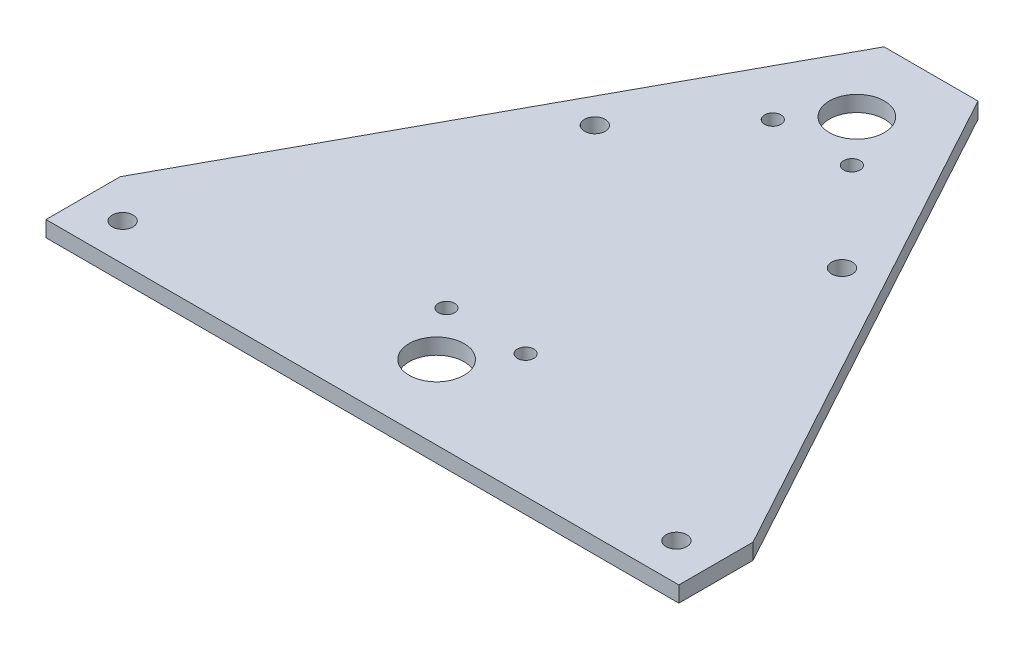
ISO-10303-21;
HEADER;
FILE_DESCRIPTION(('STEP AP214'),'2;1');
FILE_NAME('part.step','',(''),(''),'','','');
FILE_SCHEMA(('AUTOMOTIVE_DESIGN { 1 0 10303 214 1 1 1 1 }'));
ENDSEC;
DATA;
#1=APPLICATION_CONTEXT('core data for automotive mechanical design processes');
#2=APPLICATION_PROTOCOL_DEFINITION('international standard','automotive_design',2000,#1);
#3=PRODUCT_CONTEXT('',#1,'mechanical');
#4=PRODUCT('Part','Part','',(#3));
#5=PRODUCT_RELATED_PRODUCT_CATEGORY('part','',(#4));
#6=PRODUCT_DEFINITION_FORMATION('','',#4);
#7=PRODUCT_DEFINITION_CONTEXT('part definition',#1,'design');
#8=PRODUCT_DEFINITION('design','',#6,#7);
#9=PRODUCT_DEFINITION_SHAPE('','',#8);
#10=(LENGTH_UNIT() NAMED_UNIT(*) SI_UNIT(.MILLI.,.METRE.));
#11=(NAMED_UNIT(*) PLANE_ANGLE_UNIT() SI_UNIT($,.RADIAN.));
#12=(NAMED_UNIT(*) SI_UNIT($,.STERADIAN.) SOLID_ANGLE_UNIT());
#13=UNCERTAINTY_MEASURE_WITH_UNIT(LENGTH_MEASURE(1.E-05),#10,'distance_accuracy_value','');
#14=(GEOMETRIC_REPRESENTATION_CONTEXT(3) GLOBAL_UNCERTAINTY_ASSIGNED_CONTEXT((#13)) GLOBAL_UNIT_ASSIGNED_CONTEXT((#10,
#11,#12)) REPRESENTATION_CONTEXT('',''));
#15=CARTESIAN_POINT('',(0.,0.,0.));
#16=DIRECTION('',(0.,0.,1.));
#17=DIRECTION('',(1.,0.,0.));
#18=AXIS2_PLACEMENT_3D('',#15,#16,#17);
#19=CARTESIAN_POINT('',(0.,16.,0.));
#20=DIRECTION('',(0.,1.,0.));
#21=DIRECTION('',(0.,0.,1.));
#22=AXIS2_PLACEMENT_3D('',#19,#20,#21);
#23=PLANE('',#22);
#24=CARTESIAN_POINT('',(125.,16.,-285.));
#25=DIRECTION('',(0.,1.,0.));
#26=DIRECTION('',(0.,0.,1.));
#27=AXIS2_PLACEMENT_3D('',#24,#25,#26);
#28=CIRCLE('',#27,10.5);
#29=CARTESIAN_POINT('',(125.,16.,-274.5));
#30=VERTEX_POINT('',#29);
#31=EDGE_CURVE('E219',#30,#30,#28,.T.);
#32=ORIENTED_EDGE('',*,*,#31,.F.);
#33=EDGE_LOOP('',(#32));
#34=FACE_BOUND('',#33,.T.);
#35=CARTESIAN_POINT('',(-280.,16.,37.5));
#36=DIRECTION('',(0.,1.,0.));
#37=DIRECTION('',(0.,0.,-1.));
#38=AXIS2_PLACEMENT_3D('',#35,#36,#37);
#39=CIRCLE('',#38,10.5);
#40=CARTESIAN_POINT('',(-280.,16.,27.));
#41=VERTEX_POINT('',#40);
#42=EDGE_CURVE('E231',#41,#41,#39,.T.);
#43=ORIENTED_EDGE('',*,*,#42,.F.);
#44=EDGE_LOOP('',(#43));
#45=FACE_BOUND('',#44,.T.);
#46=CARTESIAN_POINT('',(40.,16.,-380.));
#47=DIRECTION('',(0.,1.,0.));
#48=DIRECTION('',(0.,0.,1.));
#49=AXIS2_PLACEMENT_3D('',#46,#47,#48);
#50=CIRCLE('',#49,8.29999999999999);
#51=CARTESIAN_POINT('',(40.,16.,-371.7));
#52=VERTEX_POINT('',#51);
#53=EDGE_CURVE('E243',#52,#52,#50,.T.);
#54=ORIENTED_EDGE('',*,*,#53,.F.);
#55=EDGE_LOOP('',(#54));
#56=FACE_BOUND('',#55,.T.);
#57=CARTESIAN_POINT('',(40.,16.,-49.9999999999999));
#58=DIRECTION('',(0.,1.,0.));
#59=DIRECTION('',(0.,0.,1.));
#60=AXIS2_PLACEMENT_3D('',#57,#58,#59);
#61=CIRCLE('',#60,8.3);
#62=CARTESIAN_POINT('',(40.,16.,-41.6999999999999));
#63=VERTEX_POINT('',#62);
#64=EDGE_CURVE('E255',#63,#63,#61,.T.);
#65=ORIENTED_EDGE('',*,*,#64,.F.);
#66=EDGE_LOOP('',(#65));
#67=FACE_BOUND('',#66,.T.);
#68=CARTESIAN_POINT('',(0.,16.,0.));
#69=DIRECTION('',(0.,1.,0.));
#70=DIRECTION('',(0.,0.,1.));
#71=AXIS2_PLACEMENT_3D('',#68,#69,#70);
#72=CIRCLE('',#71,27.8);
#73=CARTESIAN_POINT('',(0.,16.,27.8));
#74=VERTEX_POINT('',#73);
#75=EDGE_CURVE('E128',#74,#74,#72,.T.);
#76=ORIENTED_EDGE('',*,*,#75,.F.);
#77=EDGE_LOOP('',(#76));
#78=FACE_BOUND('',#77,.T.);
#79=DIRECTION('',(0.,0.,-1.));
#80=VECTOR('',#79,1.);
#81=CARTESIAN_POINT('',(320.,16.,75.));
#82=LINE('',#81,#80);
#83=CARTESIAN_POINT('',(320.,16.,75.));
#84=VERTEX_POINT('',#83);
#85=CARTESIAN_POINT('',(320.,16.,0.));
#86=VERTEX_POINT('',#85);
#87=EDGE_CURVE('E135',#84,#86,#82,.T.);
#88=ORIENTED_EDGE('',*,*,#87,.T.);
#89=DIRECTION('',(-0.478544499492619,0.,-0.87806330182132));
#90=VECTOR('',#89,1.);
#91=CARTESIAN_POINT('',(320.,16.,0.));
#92=LINE('',#91,#90);
#93=CARTESIAN_POINT('',(47.5,16.,-500.));
#94=VERTEX_POINT('',#93);
#95=EDGE_CURVE('E93',#86,#94,#92,.T.);
#96=ORIENTED_EDGE('',*,*,#95,.T.);
#97=DIRECTION('',(-1.,0.,0.));
#98=VECTOR('',#97,1.);
#99=CARTESIAN_POINT('',(47.5,16.,-500.));
#100=LINE('',#99,#98);
#101=CARTESIAN_POINT('',(-47.5,16.,-500.));
#102=VERTEX_POINT('',#101);
#103=EDGE_CURVE('E106',#94,#102,#100,.T.);
#104=ORIENTED_EDGE('',*,*,#103,.T.);
#105=DIRECTION('',(-0.478544499492619,0.,0.87806330182132));
#106=VECTOR('',#105,1.);
#107=CARTESIAN_POINT('',(-320.,16.,0.));
#108=LINE('',#107,#106);
#109=CARTESIAN_POINT('',(-320.,16.,0.));
#110=VERTEX_POINT('',#109);
#111=EDGE_CURVE('E100',#102,#110,#108,.T.);
#112=ORIENTED_EDGE('',*,*,#111,.T.);
#113=DIRECTION('',(0.,0.,1.));
#114=VECTOR('',#113,1.);
#115=CARTESIAN_POINT('',(-320.,16.,75.));
#116=LINE('',#115,#114);
#117=CARTESIAN_POINT('',(-320.,16.,75.));
#118=VERTEX_POINT('',#117);
#119=EDGE_CURVE('E104',#110,#118,#116,.T.);
#120=ORIENTED_EDGE('',*,*,#119,.T.);
#121=DIRECTION('',(1.,0.,0.));
#122=VECTOR('',#121,1.);
#123=CARTESIAN_POINT('',(320.,16.,75.));
#124=LINE('',#123,#122);
#125=EDGE_CURVE('E56',#118,#84,#124,.T.);
#126=ORIENTED_EDGE('',*,*,#125,.T.);
#127=EDGE_LOOP('',(#88,#96,#104,#112,#120,#126));
#128=FACE_BOUND('',#127,.T.);
#129=CARTESIAN_POINT('',(0.,16.,-425.));
#130=DIRECTION('',(0.,1.,0.));
#131=DIRECTION('',(0.,0.,1.));
#132=AXIS2_PLACEMENT_3D('',#129,#130,#131);
#133=CIRCLE('',#132,27.8);
#134=CARTESIAN_POINT('',(0.,16.,-397.2));
#135=VERTEX_POINT('',#134);
#136=EDGE_CURVE('E261',#135,#135,#133,.T.);
#137=ORIENTED_EDGE('',*,*,#136,.F.);
#138=EDGE_LOOP('',(#137));
#139=FACE_BOUND('',#138,.T.);
#140=CARTESIAN_POINT('',(-40.,16.,-49.9999999999999));
#141=DIRECTION('',(0.,1.,0.));
#142=DIRECTION('',(0.,0.,-1.));
#143=AXIS2_PLACEMENT_3D('',#140,#141,#142);
#144=CIRCLE('',#143,8.3);
#145=CARTESIAN_POINT('',(-40.,16.,-58.2999999999999));
#146=VERTEX_POINT('',#145);
#147=EDGE_CURVE('E249',#146,#146,#144,.T.);
#148=ORIENTED_EDGE('',*,*,#147,.F.);
#149=EDGE_LOOP('',(#148));
#150=FACE_BOUND('',#149,.T.);
#151=CARTESIAN_POINT('',(-40.,16.,-380.));
#152=DIRECTION('',(0.,1.,0.));
#153=DIRECTION('',(0.,0.,-1.));
#154=AXIS2_PLACEMENT_3D('',#151,#152,#153);
#155=CIRCLE('',#154,8.29999999999999);
#156=CARTESIAN_POINT('',(-40.,16.,-388.3));
#157=VERTEX_POINT('',#156);
#158=EDGE_CURVE('E237',#157,#157,#155,.T.);
#159=ORIENTED_EDGE('',*,*,#158,.F.);
#160=EDGE_LOOP('',(#159));
#161=FACE_BOUND('',#160,.T.);
#162=CARTESIAN_POINT('',(280.,16.,37.5));
#163=DIRECTION('',(0.,1.,0.));
#164=DIRECTION('',(0.,0.,1.));
#165=AXIS2_PLACEMENT_3D('',#162,#163,#164);
#166=CIRCLE('',#165,10.5);
#167=CARTESIAN_POINT('',(280.,16.,48.));
#168=VERTEX_POINT('',#167);
#169=EDGE_CURVE('E225',#168,#168,#166,.T.);
#170=ORIENTED_EDGE('',*,*,#169,.F.);
#171=EDGE_LOOP('',(#170));
#172=FACE_BOUND('',#171,.T.);
#173=CARTESIAN_POINT('',(-125.,16.,-285.));
#174=DIRECTION('',(0.,1.,0.));
#175=DIRECTION('',(0.,0.,-1.));
#176=AXIS2_PLACEMENT_3D('',#173,#174,#175);
#177=CIRCLE('',#176,10.5);
#178=CARTESIAN_POINT('',(-125.,16.,-295.5));
#179=VERTEX_POINT('',#178);
#180=EDGE_CURVE('E210',#179,#179,#177,.T.);
#181=ORIENTED_EDGE('',*,*,#180,.F.);
#182=EDGE_LOOP('',(#181));
#183=FACE_BOUND('',#182,.T.);
#184=ADVANCED_FACE('F39',(#34,#45,#56,#67,#78,#128,#139,#150,#161,#172,#183),#23,.T.);
#185=CARTESIAN_POINT('',(0.,0.,0.));
#186=DIRECTION('',(0.,1.,0.));
#187=DIRECTION('',(0.,0.,1.));
#188=AXIS2_PLACEMENT_3D('',#185,#186,#187);
#189=PLANE('',#188);
#190=DIRECTION('',(0.,0.,-1.));
#191=VECTOR('',#190,1.);
#192=CARTESIAN_POINT('',(320.,0.,75.));
#193=LINE('',#192,#191);
#194=CARTESIAN_POINT('',(320.,0.,75.));
#195=VERTEX_POINT('',#194);
#196=CARTESIAN_POINT('',(320.,0.,0.));
#197=VERTEX_POINT('',#196);
#198=EDGE_CURVE('E124',#195,#197,#193,.T.);
#199=ORIENTED_EDGE('',*,*,#198,.F.);
#200=DIRECTION('',(1.,0.,0.));
#201=VECTOR('',#200,1.);
#202=CARTESIAN_POINT('',(320.,0.,75.));
#203=LINE('',#202,#201);
#204=CARTESIAN_POINT('',(-320.,0.,75.));
#205=VERTEX_POINT('',#204);
#206=EDGE_CURVE('E85',#205,#195,#203,.T.);
#207=ORIENTED_EDGE('',*,*,#206,.F.);
#208=DIRECTION('',(0.,0.,1.));
#209=VECTOR('',#208,1.);
#210=CARTESIAN_POINT('',(-320.,0.,75.));
#211=LINE('',#210,#209);
#212=CARTESIAN_POINT('',(-320.,0.,0.));
#213=VERTEX_POINT('',#212);
#214=EDGE_CURVE('E79',#213,#205,#211,.T.);
#215=ORIENTED_EDGE('',*,*,#214,.F.);
#216=DIRECTION('',(-0.478544499492619,0.,0.87806330182132));
#217=VECTOR('',#216,1.);
#218=CARTESIAN_POINT('',(-320.,0.,0.));
#219=LINE('',#218,#217);
#220=CARTESIAN_POINT('',(-47.5,0.,-500.));
#221=VERTEX_POINT('',#220);
#222=EDGE_CURVE('E114',#221,#213,#219,.T.);
#223=ORIENTED_EDGE('',*,*,#222,.F.);
#224=DIRECTION('',(-1.,0.,0.));
#225=VECTOR('',#224,1.);
#226=CARTESIAN_POINT('',(47.5,0.,-500.));
#227=LINE('',#226,#225);
#228=CARTESIAN_POINT('',(47.5,0.,-500.));
#229=VERTEX_POINT('',#228);
#230=EDGE_CURVE('E130',#229,#221,#227,.T.);
#231=ORIENTED_EDGE('',*,*,#230,.F.);
#232=DIRECTION('',(-0.478544499492619,0.,-0.87806330182132));
#233=VECTOR('',#232,1.);
#234=CARTESIAN_POINT('',(320.,0.,0.));
#235=LINE('',#234,#233);
#236=EDGE_CURVE('E127',#197,#229,#235,.T.);
#237=ORIENTED_EDGE('',*,*,#236,.F.);
#238=EDGE_LOOP('',(#199,#207,#215,#223,#231,#237));
#239=FACE_BOUND('',#238,.T.);
#240=CARTESIAN_POINT('',(0.,0.,0.));
#241=DIRECTION('',(0.,1.,0.));
#242=DIRECTION('',(0.,0.,1.));
#243=AXIS2_PLACEMENT_3D('',#240,#241,#242);
#244=CIRCLE('',#243,27.8);
#245=CARTESIAN_POINT('',(0.,0.,27.8));
#246=VERTEX_POINT('',#245);
#247=EDGE_CURVE('E264',#246,#246,#244,.T.);
#248=ORIENTED_EDGE('',*,*,#247,.T.);
#249=EDGE_LOOP('',(#248));
#250=FACE_BOUND('',#249,.T.);
#251=CARTESIAN_POINT('',(0.,0.,-425.));
#252=DIRECTION('',(0.,1.,0.));
#253=DIRECTION('',(0.,0.,1.));
#254=AXIS2_PLACEMENT_3D('',#251,#252,#253);
#255=CIRCLE('',#254,27.8);
#256=CARTESIAN_POINT('',(0.,0.,-397.2));
#257=VERTEX_POINT('',#256);
#258=EDGE_CURVE('E258',#257,#257,#255,.T.);
#259=ORIENTED_EDGE('',*,*,#258,.T.);
#260=EDGE_LOOP('',(#259));
#261=FACE_BOUND('',#260,.T.);
#262=CARTESIAN_POINT('',(40.,0.,-49.9999999999999));
#263=DIRECTION('',(0.,1.,0.));
#264=DIRECTION('',(0.,0.,1.));
#265=AXIS2_PLACEMENT_3D('',#262,#263,#264);
#266=CIRCLE('',#265,8.3);
#267=CARTESIAN_POINT('',(40.,0.,-41.6999999999999));
#268=VERTEX_POINT('',#267);
#269=EDGE_CURVE('E252',#268,#268,#266,.T.);
#270=ORIENTED_EDGE('',*,*,#269,.T.);
#271=EDGE_LOOP('',(#270));
#272=FACE_BOUND('',#271,.T.);
#273=CARTESIAN_POINT('',(-40.,0.,-49.9999999999999));
#274=DIRECTION('',(0.,1.,0.));
#275=DIRECTION('',(0.,0.,-1.));
#276=AXIS2_PLACEMENT_3D('',#273,#274,#275);
#277=CIRCLE('',#276,8.3);
#278=CARTESIAN_POINT('',(-40.,0.,-58.2999999999999));
#279=VERTEX_POINT('',#278);
#280=EDGE_CURVE('E246',#279,#279,#277,.T.);
#281=ORIENTED_EDGE('',*,*,#280,.T.);
#282=EDGE_LOOP('',(#281));
#283=FACE_BOUND('',#282,.T.);
#284=CARTESIAN_POINT('',(40.,0.,-380.));
#285=DIRECTION('',(0.,1.,0.));
#286=DIRECTION('',(0.,0.,1.));
#287=AXIS2_PLACEMENT_3D('',#284,#285,#286);
#288=CIRCLE('',#287,8.29999999999999);
#289=CARTESIAN_POINT('',(40.,0.,-371.7));
#290=VERTEX_POINT('',#289);
#291=EDGE_CURVE('E240',#290,#290,#288,.T.);
#292=ORIENTED_EDGE('',*,*,#291,.T.);
#293=EDGE_LOOP('',(#292));
#294=FACE_BOUND('',#293,.T.);
#295=CARTESIAN_POINT('',(-40.,0.,-380.));
#296=DIRECTION('',(0.,1.,0.));
#297=DIRECTION('',(0.,0.,-1.));
#298=AXIS2_PLACEMENT_3D('',#295,#296,#297);
#299=CIRCLE('',#298,8.29999999999999);
#300=CARTESIAN_POINT('',(-40.,0.,-388.3));
#301=VERTEX_POINT('',#300);
#302=EDGE_CURVE('E234',#301,#301,#299,.T.);
#303=ORIENTED_EDGE('',*,*,#302,.T.);
#304=EDGE_LOOP('',(#303));
#305=FACE_BOUND('',#304,.T.);
#306=CARTESIAN_POINT('',(-280.,0.,37.5));
#307=DIRECTION('',(0.,1.,0.));
#308=DIRECTION('',(0.,0.,-1.));
#309=AXIS2_PLACEMENT_3D('',#306,#307,#308);
#310=CIRCLE('',#309,10.5);
#311=CARTESIAN_POINT('',(-280.,0.,27.));
#312=VERTEX_POINT('',#311);
#313=EDGE_CURVE('E228',#312,#312,#310,.T.);
#314=ORIENTED_EDGE('',*,*,#313,.T.);
#315=EDGE_LOOP('',(#314));
#316=FACE_BOUND('',#315,.T.);
#317=CARTESIAN_POINT('',(280.,0.,37.5));
#318=DIRECTION('',(0.,1.,0.));
#319=DIRECTION('',(0.,0.,1.));
#320=AXIS2_PLACEMENT_3D('',#317,#318,#319);
#321=CIRCLE('',#320,10.5);
#322=CARTESIAN_POINT('',(280.,0.,48.));
#323=VERTEX_POINT('',#322);
#324=EDGE_CURVE('E222',#323,#323,#321,.T.);
#325=ORIENTED_EDGE('',*,*,#324,.T.);
#326=EDGE_LOOP('',(#325));
#327=FACE_BOUND('',#326,.T.);
#328=CARTESIAN_POINT('',(125.,0.,-285.));
#329=DIRECTION('',(0.,1.,0.));
#330=DIRECTION('',(0.,0.,1.));
#331=AXIS2_PLACEMENT_3D('',#328,#329,#330);
#332=CIRCLE('',#331,10.5);
#333=CARTESIAN_POINT('',(125.,0.,-274.5));
#334=VERTEX_POINT('',#333);
#335=EDGE_CURVE('E216',#334,#334,#332,.T.);
#336=ORIENTED_EDGE('',*,*,#335,.T.);
#337=EDGE_LOOP('',(#336));
#338=FACE_BOUND('',#337,.T.);
#339=CARTESIAN_POINT('',(-125.,0.,-285.));
#340=DIRECTION('',(0.,1.,0.));
#341=DIRECTION('',(0.,0.,-1.));
#342=AXIS2_PLACEMENT_3D('',#339,#340,#341);
#343=CIRCLE('',#342,10.5);
#344=CARTESIAN_POINT('',(-125.,0.,-295.5));
#345=VERTEX_POINT('',#344);
#346=EDGE_CURVE('E213',#345,#345,#343,.T.);
#347=ORIENTED_EDGE('',*,*,#346,.T.);
#348=EDGE_LOOP('',(#347));
#349=FACE_BOUND('',#348,.T.);
#350=ADVANCED_FACE('F144',(#239,#250,#261,#272,#283,#294,#305,#316,#327,#338,#349),#189,.F.);
#351=CARTESIAN_POINT('',(320.,16.,75.));
#352=DIRECTION('',(-1.,0.,0.));
#353=DIRECTION('',(0.,0.,1.));
#354=AXIS2_PLACEMENT_3D('',#351,#352,#353);
#355=PLANE('',#354);
#356=ORIENTED_EDGE('',*,*,#198,.T.);
#357=DIRECTION('',(0.,-1.,0.));
#358=VECTOR('',#357,1.);
#359=CARTESIAN_POINT('',(320.,16.,0.));
#360=LINE('',#359,#358);
#361=EDGE_CURVE('E11',#86,#197,#360,.T.);
#362=ORIENTED_EDGE('',*,*,#361,.F.);
#363=ORIENTED_EDGE('',*,*,#87,.F.);
#364=DIRECTION('',(0.,-1.,0.));
#365=VECTOR('',#364,1.);
#366=CARTESIAN_POINT('',(320.,16.,75.));
#367=LINE('',#366,#365);
#368=EDGE_CURVE('E120',#84,#195,#367,.T.);
#369=ORIENTED_EDGE('',*,*,#368,.T.);
#370=EDGE_LOOP('',(#356,#362,#363,#369));
#371=FACE_BOUND('',#370,.T.);
#372=ADVANCED_FACE('F41',(#371),#355,.F.);
#373=CARTESIAN_POINT('',(320.,16.,0.));
#374=DIRECTION('',(-0.87806330182132,0.,0.478544499492619));
#375=DIRECTION('',(0.478544499492619,0.,0.87806330182132));
#376=AXIS2_PLACEMENT_3D('',#373,#374,#375);
#377=PLANE('',#376);
#378=ORIENTED_EDGE('',*,*,#236,.T.);
#379=DIRECTION('',(0.,-1.,0.));
#380=VECTOR('',#379,1.);
#381=CARTESIAN_POINT('',(47.5,16.,-500.));
#382=LINE('',#381,#380);
#383=EDGE_CURVE('E48',#94,#229,#382,.T.);
#384=ORIENTED_EDGE('',*,*,#383,.F.);
#385=ORIENTED_EDGE('',*,*,#95,.F.);
#386=ORIENTED_EDGE('',*,*,#361,.T.);
#387=EDGE_LOOP('',(#378,#384,#385,#386));
#388=FACE_BOUND('',#387,.T.);
#389=ADVANCED_FACE('F386',(#388),#377,.F.);
#390=CARTESIAN_POINT('',(47.5,16.,-500.));
#391=DIRECTION('',(0.,0.,1.));
#392=DIRECTION('',(1.,0.,0.));
#393=AXIS2_PLACEMENT_3D('',#390,#391,#392);
#394=PLANE('',#393);
#395=ORIENTED_EDGE('',*,*,#230,.T.);
#396=DIRECTION('',(0.,-1.,0.));
#397=VECTOR('',#396,1.);
#398=CARTESIAN_POINT('',(-47.5,16.,-500.));
#399=LINE('',#398,#397);
#400=EDGE_CURVE('E115',#102,#221,#399,.T.);
#401=ORIENTED_EDGE('',*,*,#400,.F.);
#402=ORIENTED_EDGE('',*,*,#103,.F.);
#403=ORIENTED_EDGE('',*,*,#383,.T.);
#404=EDGE_LOOP('',(#395,#401,#402,#403));
#405=FACE_BOUND('',#404,.T.);
#406=ADVANCED_FACE('F141',(#405),#394,.F.);
#407=CARTESIAN_POINT('',(-320.,16.,0.));
#408=DIRECTION('',(0.87806330182132,0.,0.478544499492619));
#409=DIRECTION('',(0.478544499492619,0.,-0.87806330182132));
#410=AXIS2_PLACEMENT_3D('',#407,#408,#409);
#411=PLANE('',#410);
#412=ORIENTED_EDGE('',*,*,#222,.T.);
#413=DIRECTION('',(0.,-1.,0.));
#414=VECTOR('',#413,1.);
#415=CARTESIAN_POINT('',(-320.,16.,0.));
#416=LINE('',#415,#414);
#417=EDGE_CURVE('E111',#110,#213,#416,.T.);
#418=ORIENTED_EDGE('',*,*,#417,.F.);
#419=ORIENTED_EDGE('',*,*,#111,.F.);
#420=ORIENTED_EDGE('',*,*,#400,.T.);
#421=EDGE_LOOP('',(#412,#418,#419,#420));
#422=FACE_BOUND('',#421,.T.);
#423=ADVANCED_FACE('F112',(#422),#411,.F.);
#424=CARTESIAN_POINT('',(-320.,16.,75.));
#425=DIRECTION('',(1.,0.,0.));
#426=DIRECTION('',(0.,0.,-1.));
#427=AXIS2_PLACEMENT_3D('',#424,#425,#426);
#428=PLANE('',#427);
#429=ORIENTED_EDGE('',*,*,#214,.T.);
#430=DIRECTION('',(0.,-1.,0.));
#431=VECTOR('',#430,1.);
#432=CARTESIAN_POINT('',(-320.,16.,75.));
#433=LINE('',#432,#431);
#434=EDGE_CURVE('E116',#118,#205,#433,.T.);
#435=ORIENTED_EDGE('',*,*,#434,.F.);
#436=ORIENTED_EDGE('',*,*,#119,.F.);
#437=ORIENTED_EDGE('',*,*,#417,.T.);
#438=EDGE_LOOP('',(#429,#435,#436,#437));
#439=FACE_BOUND('',#438,.T.);
#440=ADVANCED_FACE('F118',(#439),#428,.F.);
#441=CARTESIAN_POINT('',(320.,16.,75.));
#442=DIRECTION('',(0.,0.,-1.));
#443=DIRECTION('',(-1.,0.,0.));
#444=AXIS2_PLACEMENT_3D('',#441,#442,#443);
#445=PLANE('',#444);
#446=ORIENTED_EDGE('',*,*,#206,.T.);
#447=ORIENTED_EDGE('',*,*,#368,.F.);
#448=ORIENTED_EDGE('',*,*,#125,.F.);
#449=ORIENTED_EDGE('',*,*,#434,.T.);
#450=EDGE_LOOP('',(#446,#447,#448,#449));
#451=FACE_BOUND('',#450,.T.);
#452=ADVANCED_FACE('F149',(#451),#445,.F.);
#453=CARTESIAN_POINT('',(0.,16.,0.));
#454=DIRECTION('',(0.,-1.,0.));
#455=DIRECTION('',(0.,0.,-1.));
#456=AXIS2_PLACEMENT_3D('',#453,#454,#455);
#457=CYLINDRICAL_SURFACE('',#456,27.8);
#458=ORIENTED_EDGE('',*,*,#75,.T.);
#459=EDGE_LOOP('',(#458));
#460=FACE_BOUND('',#459,.T.);
#461=ORIENTED_EDGE('',*,*,#247,.F.);
#462=EDGE_LOOP('',(#461));
#463=FACE_BOUND('',#462,.T.);
#464=ADVANCED_FACE('F151',(#460,#463),#457,.F.);
#465=CARTESIAN_POINT('',(0.,16.,-425.));
#466=DIRECTION('',(0.,-1.,0.));
#467=DIRECTION('',(0.,0.,-1.));
#468=AXIS2_PLACEMENT_3D('',#465,#466,#467);
#469=CYLINDRICAL_SURFACE('',#468,27.8);
#470=ORIENTED_EDGE('',*,*,#136,.T.);
#471=EDGE_LOOP('',(#470));
#472=FACE_BOUND('',#471,.T.);
#473=ORIENTED_EDGE('',*,*,#258,.F.);
#474=EDGE_LOOP('',(#473));
#475=FACE_BOUND('',#474,.T.);
#476=ADVANCED_FACE('F157',(#472,#475),#469,.F.);
#477=CARTESIAN_POINT('',(40.,16.,-49.9999999999999));
#478=DIRECTION('',(0.,-1.,0.));
#479=DIRECTION('',(0.,0.,-1.));
#480=AXIS2_PLACEMENT_3D('',#477,#478,#479);
#481=CYLINDRICAL_SURFACE('',#480,8.3);
#482=ORIENTED_EDGE('',*,*,#64,.T.);
#483=EDGE_LOOP('',(#482));
#484=FACE_BOUND('',#483,.T.);
#485=ORIENTED_EDGE('',*,*,#269,.F.);
#486=EDGE_LOOP('',(#485));
#487=FACE_BOUND('',#486,.T.);
#488=ADVANCED_FACE('F173',(#484,#487),#481,.F.);
#489=CARTESIAN_POINT('',(-40.,16.,-49.9999999999999));
#490=DIRECTION('',(0.,-1.,0.));
#491=DIRECTION('',(0.,0.,-1.));
#492=AXIS2_PLACEMENT_3D('',#489,#490,#491);
#493=CYLINDRICAL_SURFACE('',#492,8.3);
#494=ORIENTED_EDGE('',*,*,#147,.T.);
#495=EDGE_LOOP('',(#494));
#496=FACE_BOUND('',#495,.T.);
#497=ORIENTED_EDGE('',*,*,#280,.F.);
#498=EDGE_LOOP('',(#497));
#499=FACE_BOUND('',#498,.T.);
#500=ADVANCED_FACE('F177',(#496,#499),#493,.F.);
#501=CARTESIAN_POINT('',(40.,16.,-380.));
#502=DIRECTION('',(0.,-1.,0.));
#503=DIRECTION('',(0.,0.,-1.));
#504=AXIS2_PLACEMENT_3D('',#501,#502,#503);
#505=CYLINDRICAL_SURFACE('',#504,8.29999999999999);
#506=ORIENTED_EDGE('',*,*,#53,.T.);
#507=EDGE_LOOP('',(#506));
#508=FACE_BOUND('',#507,.T.);
#509=ORIENTED_EDGE('',*,*,#291,.F.);
#510=EDGE_LOOP('',(#509));
#511=FACE_BOUND('',#510,.T.);
#512=ADVANCED_FACE('F181',(#508,#511),#505,.F.);
#513=CARTESIAN_POINT('',(-40.,16.,-380.));
#514=DIRECTION('',(0.,-1.,0.));
#515=DIRECTION('',(0.,0.,-1.));
#516=AXIS2_PLACEMENT_3D('',#513,#514,#515);
#517=CYLINDRICAL_SURFACE('',#516,8.29999999999999);
#518=ORIENTED_EDGE('',*,*,#158,.T.);
#519=EDGE_LOOP('',(#518));
#520=FACE_BOUND('',#519,.T.);
#521=ORIENTED_EDGE('',*,*,#302,.F.);
#522=EDGE_LOOP('',(#521));
#523=FACE_BOUND('',#522,.T.);
#524=ADVANCED_FACE('F185',(#520,#523),#517,.F.);
#525=CARTESIAN_POINT('',(-280.,16.,37.5));
#526=DIRECTION('',(0.,-1.,0.));
#527=DIRECTION('',(0.,0.,-1.));
#528=AXIS2_PLACEMENT_3D('',#525,#526,#527);
#529=CYLINDRICAL_SURFACE('',#528,10.5);
#530=ORIENTED_EDGE('',*,*,#42,.T.);
#531=EDGE_LOOP('',(#530));
#532=FACE_BOUND('',#531,.T.);
#533=ORIENTED_EDGE('',*,*,#313,.F.);
#534=EDGE_LOOP('',(#533));
#535=FACE_BOUND('',#534,.T.);
#536=ADVANCED_FACE('F189',(#532,#535),#529,.F.);
#537=CARTESIAN_POINT('',(280.,16.,37.5));
#538=DIRECTION('',(0.,-1.,0.));
#539=DIRECTION('',(0.,0.,-1.));
#540=AXIS2_PLACEMENT_3D('',#537,#538,#539);
#541=CYLINDRICAL_SURFACE('',#540,10.5);
#542=ORIENTED_EDGE('',*,*,#169,.T.);
#543=EDGE_LOOP('',(#542));
#544=FACE_BOUND('',#543,.T.);
#545=ORIENTED_EDGE('',*,*,#324,.F.);
#546=EDGE_LOOP('',(#545));
#547=FACE_BOUND('',#546,.T.);
#548=ADVANCED_FACE('F193',(#544,#547),#541,.F.);
#549=CARTESIAN_POINT('',(125.,16.,-285.));
#550=DIRECTION('',(0.,-1.,0.));
#551=DIRECTION('',(0.,0.,-1.));
#552=AXIS2_PLACEMENT_3D('',#549,#550,#551);
#553=CYLINDRICAL_SURFACE('',#552,10.5);
#554=ORIENTED_EDGE('',*,*,#31,.T.);
#555=EDGE_LOOP('',(#554));
#556=FACE_BOUND('',#555,.T.);
#557=ORIENTED_EDGE('',*,*,#335,.F.);
#558=EDGE_LOOP('',(#557));
#559=FACE_BOUND('',#558,.T.);
#560=ADVANCED_FACE('F197',(#556,#559),#553,.F.);
#561=CARTESIAN_POINT('',(-125.,16.,-285.));
#562=DIRECTION('',(0.,-1.,0.));
#563=DIRECTION('',(0.,0.,-1.));
#564=AXIS2_PLACEMENT_3D('',#561,#562,#563);
#565=CYLINDRICAL_SURFACE('',#564,10.5);
#566=ORIENTED_EDGE('',*,*,#180,.T.);
#567=EDGE_LOOP('',(#566));
#568=FACE_BOUND('',#567,.T.);
#569=ORIENTED_EDGE('',*,*,#346,.F.);
#570=EDGE_LOOP('',(#569));
#571=FACE_BOUND('',#570,.T.);
#572=ADVANCED_FACE('F201',(#568,#571),#565,.F.);
#573=CLOSED_SHELL('',(#184,#350,#372,#389,#406,#423,#440,#452,#464,#476,#488,#500,#512,#524,
#536,#548,#560,#572));
#574=MANIFOLD_SOLID_BREP('B2',#573);
#575=ADVANCED_BREP_SHAPE_REPRESENTATION('',(#18,#574),#14);
#576=SHAPE_DEFINITION_REPRESENTATION(#9,#575);
ENDSEC;
END-ISO-10303-21;
